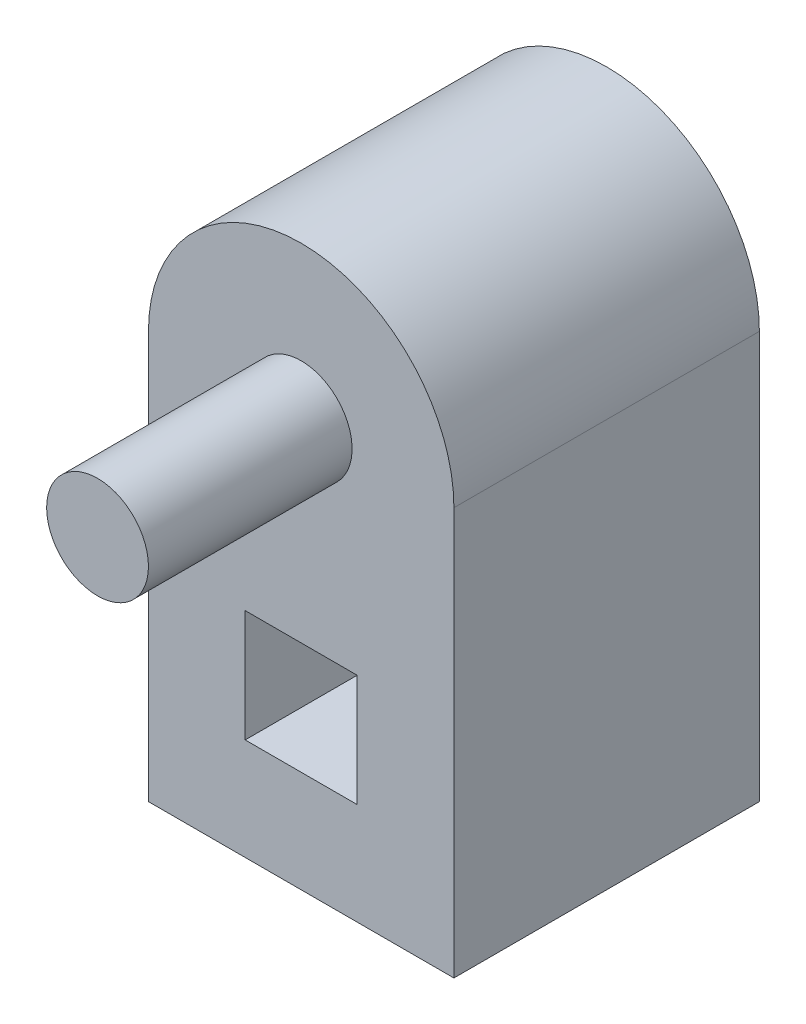
ISO-10303-21;
HEADER;
FILE_DESCRIPTION(('STEP AP214'),'2;1');
FILE_NAME('part.step','',(''),(''),'','','');
FILE_SCHEMA(('AUTOMOTIVE_DESIGN { 1 0 10303 214 1 1 1 1 }'));
ENDSEC;
DATA;
#1=APPLICATION_CONTEXT('core data for automotive mechanical design processes');
#2=APPLICATION_PROTOCOL_DEFINITION('international standard','automotive_design',2000,#1);
#3=PRODUCT_CONTEXT('',#1,'mechanical');
#4=PRODUCT('Part','Part','',(#3));
#5=PRODUCT_RELATED_PRODUCT_CATEGORY('part','',(#4));
#6=PRODUCT_DEFINITION_FORMATION('','',#4);
#7=PRODUCT_DEFINITION_CONTEXT('part definition',#1,'design');
#8=PRODUCT_DEFINITION('design','',#6,#7);
#9=PRODUCT_DEFINITION_SHAPE('','',#8);
#10=(LENGTH_UNIT() NAMED_UNIT(*) SI_UNIT(.MILLI.,.METRE.));
#11=(NAMED_UNIT(*) PLANE_ANGLE_UNIT() SI_UNIT($,.RADIAN.));
#12=(NAMED_UNIT(*) SI_UNIT($,.STERADIAN.) SOLID_ANGLE_UNIT());
#13=UNCERTAINTY_MEASURE_WITH_UNIT(LENGTH_MEASURE(1.E-05),#10,'distance_accuracy_value','');
#14=(GEOMETRIC_REPRESENTATION_CONTEXT(3) GLOBAL_UNCERTAINTY_ASSIGNED_CONTEXT((#13)) GLOBAL_UNIT_ASSIGNED_CONTEXT((#10,
#11,#12)) REPRESENTATION_CONTEXT('',''));
#15=CARTESIAN_POINT('',(0.,0.,0.));
#16=DIRECTION('',(0.,0.,1.));
#17=DIRECTION('',(1.,0.,0.));
#18=AXIS2_PLACEMENT_3D('',#15,#16,#17);
#19=CARTESIAN_POINT('',(38.1,101.6,-38.1));
#20=DIRECTION('',(-1.,0.,0.));
#21=DIRECTION('',(0.,0.,1.));
#22=AXIS2_PLACEMENT_3D('',#19,#20,#21);
#23=PLANE('',#22);
#24=DIRECTION('',(0.,0.,-1.));
#25=VECTOR('',#24,1.);
#26=CARTESIAN_POINT('',(38.1,0.,-38.1));
#27=LINE('',#26,#25);
#28=CARTESIAN_POINT('',(38.1,0.,38.1));
#29=VERTEX_POINT('',#28);
#30=CARTESIAN_POINT('',(38.1,0.,-38.1));
#31=VERTEX_POINT('',#30);
#32=EDGE_CURVE('E144',#29,#31,#27,.T.);
#33=ORIENTED_EDGE('',*,*,#32,.T.);
#34=DIRECTION('',(0.,-1.,0.));
#35=VECTOR('',#34,1.);
#36=CARTESIAN_POINT('',(38.1,101.6,-38.1));
#37=LINE('',#36,#35);
#38=CARTESIAN_POINT('',(38.1,101.6,-38.1));
#39=VERTEX_POINT('',#38);
#40=EDGE_CURVE('E46',#39,#31,#37,.T.);
#41=ORIENTED_EDGE('',*,*,#40,.F.);
#42=DIRECTION('',(0.,0.,-1.));
#43=VECTOR('',#42,1.);
#44=CARTESIAN_POINT('',(38.1,101.6,-38.1));
#45=LINE('',#44,#43);
#46=CARTESIAN_POINT('',(38.1,101.6,38.1));
#47=VERTEX_POINT('',#46);
#48=EDGE_CURVE('E148',#47,#39,#45,.T.);
#49=ORIENTED_EDGE('',*,*,#48,.F.);
#50=DIRECTION('',(0.,-1.,0.));
#51=VECTOR('',#50,1.);
#52=CARTESIAN_POINT('',(38.1,101.6,38.1));
#53=LINE('',#52,#51);
#54=EDGE_CURVE('E153',#47,#29,#53,.T.);
#55=ORIENTED_EDGE('',*,*,#54,.T.);
#56=EDGE_LOOP('',(#33,#41,#49,#55));
#57=FACE_BOUND('',#56,.T.);
#58=ADVANCED_FACE('F39',(#57),#23,.F.);
#59=CARTESIAN_POINT('',(-38.1,101.6,-38.1));
#60=DIRECTION('',(0.,0.,1.));
#61=DIRECTION('',(1.,0.,0.));
#62=AXIS2_PLACEMENT_3D('',#59,#60,#61);
#63=PLANE('',#62);
#64=DIRECTION('',(1.,0.,0.));
#65=VECTOR('',#64,1.);
#66=CARTESIAN_POINT('',(-13.97,25.4,-38.1));
#67=LINE('',#66,#65);
#68=CARTESIAN_POINT('',(-13.97,25.4,-38.1));
#69=VERTEX_POINT('',#68);
#70=CARTESIAN_POINT('',(13.97,25.4,-38.1));
#71=VERTEX_POINT('',#70);
#72=EDGE_CURVE('E135',#69,#71,#67,.T.);
#73=ORIENTED_EDGE('',*,*,#72,.T.);
#74=DIRECTION('',(0.,1.,0.));
#75=VECTOR('',#74,1.);
#76=CARTESIAN_POINT('',(13.97,53.34,-38.1));
#77=LINE('',#76,#75);
#78=CARTESIAN_POINT('',(13.97,53.34,-38.1));
#79=VERTEX_POINT('',#78);
#80=EDGE_CURVE('E125',#71,#79,#77,.T.);
#81=ORIENTED_EDGE('',*,*,#80,.T.);
#82=DIRECTION('',(-1.,0.,0.));
#83=VECTOR('',#82,1.);
#84=CARTESIAN_POINT('',(-13.97,53.34,-38.1));
#85=LINE('',#84,#83);
#86=CARTESIAN_POINT('',(-13.97,53.34,-38.1));
#87=VERTEX_POINT('',#86);
#88=EDGE_CURVE('E129',#79,#87,#85,.T.);
#89=ORIENTED_EDGE('',*,*,#88,.T.);
#90=DIRECTION('',(0.,-1.,0.));
#91=VECTOR('',#90,1.);
#92=CARTESIAN_POINT('',(-13.97,53.34,-38.1));
#93=LINE('',#92,#91);
#94=EDGE_CURVE('E52',#87,#69,#93,.T.);
#95=ORIENTED_EDGE('',*,*,#94,.T.);
#96=EDGE_LOOP('',(#73,#81,#89,#95));
#97=FACE_BOUND('',#96,.T.);
#98=DIRECTION('',(0.,-1.,0.));
#99=VECTOR('',#98,1.);
#100=CARTESIAN_POINT('',(-38.1,101.6,-38.1));
#101=LINE('',#100,#99);
#102=CARTESIAN_POINT('',(-38.1,101.6,-38.1));
#103=VERTEX_POINT('',#102);
#104=CARTESIAN_POINT('',(-38.1,0.,-38.1));
#105=VERTEX_POINT('',#104);
#106=EDGE_CURVE('E167',#103,#105,#101,.T.);
#107=ORIENTED_EDGE('',*,*,#106,.F.);
#108=CARTESIAN_POINT('',(0.,101.6,-38.1));
#109=DIRECTION('',(0.,0.,1.));
#110=DIRECTION('',(1.,0.,0.));
#111=AXIS2_PLACEMENT_3D('',#108,#109,#110);
#112=CIRCLE('',#111,38.1);
#113=EDGE_CURVE('E136',#39,#103,#112,.T.);
#114=ORIENTED_EDGE('',*,*,#113,.F.);
#115=ORIENTED_EDGE('',*,*,#40,.T.);
#116=DIRECTION('',(-1.,0.,0.));
#117=VECTOR('',#116,1.);
#118=CARTESIAN_POINT('',(-38.1,0.,-38.1));
#119=LINE('',#118,#117);
#120=EDGE_CURVE('E156',#31,#105,#119,.T.);
#121=ORIENTED_EDGE('',*,*,#120,.T.);
#122=EDGE_LOOP('',(#107,#114,#115,#121));
#123=FACE_BOUND('',#122,.T.);
#124=ADVANCED_FACE('F173',(#97,#123),#63,.F.);
#125=CARTESIAN_POINT('',(-38.1,101.6,-38.1));
#126=DIRECTION('',(1.,0.,0.));
#127=DIRECTION('',(0.,0.,-1.));
#128=AXIS2_PLACEMENT_3D('',#125,#126,#127);
#129=PLANE('',#128);
#130=DIRECTION('',(0.,0.,1.));
#131=VECTOR('',#130,1.);
#132=CARTESIAN_POINT('',(-38.1,0.,-38.1));
#133=LINE('',#132,#131);
#134=CARTESIAN_POINT('',(-38.1,0.,38.1));
#135=VERTEX_POINT('',#134);
#136=EDGE_CURVE('E158',#105,#135,#133,.T.);
#137=ORIENTED_EDGE('',*,*,#136,.T.);
#138=DIRECTION('',(0.,-1.,0.));
#139=VECTOR('',#138,1.);
#140=CARTESIAN_POINT('',(-38.1,101.6,38.1));
#141=LINE('',#140,#139);
#142=CARTESIAN_POINT('',(-38.1,101.6,38.1));
#143=VERTEX_POINT('',#142);
#144=EDGE_CURVE('E162',#143,#135,#141,.T.);
#145=ORIENTED_EDGE('',*,*,#144,.F.);
#146=DIRECTION('',(0.,0.,1.));
#147=VECTOR('',#146,1.);
#148=CARTESIAN_POINT('',(-38.1,101.6,-38.1));
#149=LINE('',#148,#147);
#150=EDGE_CURVE('E149',#103,#143,#149,.T.);
#151=ORIENTED_EDGE('',*,*,#150,.F.);
#152=ORIENTED_EDGE('',*,*,#106,.T.);
#153=EDGE_LOOP('',(#137,#145,#151,#152));
#154=FACE_BOUND('',#153,.T.);
#155=ADVANCED_FACE('F177',(#154),#129,.F.);
#156=CARTESIAN_POINT('',(-38.1,101.6,38.1));
#157=DIRECTION('',(0.,0.,-1.));
#158=DIRECTION('',(-1.,0.,0.));
#159=AXIS2_PLACEMENT_3D('',#156,#157,#158);
#160=PLANE('',#159);
#161=CARTESIAN_POINT('',(0.,101.6,38.1));
#162=DIRECTION('',(0.,0.,-1.));
#163=DIRECTION('',(-1.,0.,0.));
#164=AXIS2_PLACEMENT_3D('',#161,#162,#163);
#165=CIRCLE('',#164,12.7);
#166=CARTESIAN_POINT('',(-12.7,101.6,38.1));
#167=VERTEX_POINT('',#166);
#168=EDGE_CURVE('E11',#167,#167,#165,.F.);
#169=ORIENTED_EDGE('',*,*,#168,.F.);
#170=EDGE_LOOP('',(#169));
#171=FACE_BOUND('',#170,.T.);
#172=DIRECTION('',(-1.,0.,0.));
#173=VECTOR('',#172,1.);
#174=CARTESIAN_POINT('',(-13.97,53.34,38.1));
#175=LINE('',#174,#173);
#176=CARTESIAN_POINT('',(13.97,53.34,38.1));
#177=VERTEX_POINT('',#176);
#178=CARTESIAN_POINT('',(-13.97,53.34,38.1));
#179=VERTEX_POINT('',#178);
#180=EDGE_CURVE('E111',#177,#179,#175,.T.);
#181=ORIENTED_EDGE('',*,*,#180,.F.);
#182=DIRECTION('',(0.,1.,0.));
#183=VECTOR('',#182,1.);
#184=CARTESIAN_POINT('',(13.97,53.34,38.1));
#185=LINE('',#184,#183);
#186=CARTESIAN_POINT('',(13.97,25.4,38.1));
#187=VERTEX_POINT('',#186);
#188=EDGE_CURVE('E63',#187,#177,#185,.T.);
#189=ORIENTED_EDGE('',*,*,#188,.F.);
#190=DIRECTION('',(1.,0.,0.));
#191=VECTOR('',#190,1.);
#192=CARTESIAN_POINT('',(-13.97,25.4,38.1));
#193=LINE('',#192,#191);
#194=CARTESIAN_POINT('',(-13.97,25.4,38.1));
#195=VERTEX_POINT('',#194);
#196=EDGE_CURVE('E124',#195,#187,#193,.T.);
#197=ORIENTED_EDGE('',*,*,#196,.F.);
#198=DIRECTION('',(0.,-1.,0.));
#199=VECTOR('',#198,1.);
#200=CARTESIAN_POINT('',(-13.97,53.34,38.1));
#201=LINE('',#200,#199);
#202=EDGE_CURVE('E104',#179,#195,#201,.T.);
#203=ORIENTED_EDGE('',*,*,#202,.F.);
#204=EDGE_LOOP('',(#181,#189,#197,#203));
#205=FACE_BOUND('',#204,.T.);
#206=ORIENTED_EDGE('',*,*,#54,.F.);
#207=CARTESIAN_POINT('',(0.,101.6,38.1));
#208=DIRECTION('',(0.,0.,1.));
#209=DIRECTION('',(1.,0.,0.));
#210=AXIS2_PLACEMENT_3D('',#207,#208,#209);
#211=CIRCLE('',#210,38.1);
#212=EDGE_CURVE('E142',#47,#143,#211,.T.);
#213=ORIENTED_EDGE('',*,*,#212,.T.);
#214=ORIENTED_EDGE('',*,*,#144,.T.);
#215=DIRECTION('',(1.,0.,0.));
#216=VECTOR('',#215,1.);
#217=CARTESIAN_POINT('',(-38.1,0.,38.1));
#218=LINE('',#217,#216);
#219=EDGE_CURVE('E147',#135,#29,#218,.T.);
#220=ORIENTED_EDGE('',*,*,#219,.T.);
#221=EDGE_LOOP('',(#206,#213,#214,#220));
#222=FACE_BOUND('',#221,.T.);
#223=ADVANCED_FACE('F116',(#171,#205,#222),#160,.F.);
#224=CARTESIAN_POINT('',(0.,0.,0.));
#225=DIRECTION('',(0.,1.,0.));
#226=DIRECTION('',(0.,0.,1.));
#227=AXIS2_PLACEMENT_3D('',#224,#225,#226);
#228=PLANE('',#227);
#229=ORIENTED_EDGE('',*,*,#32,.F.);
#230=ORIENTED_EDGE('',*,*,#219,.F.);
#231=ORIENTED_EDGE('',*,*,#136,.F.);
#232=ORIENTED_EDGE('',*,*,#120,.F.);
#233=EDGE_LOOP('',(#229,#230,#231,#232));
#234=FACE_BOUND('',#233,.T.);
#235=ADVANCED_FACE('F176',(#234),#228,.F.);
#236=CARTESIAN_POINT('',(0.,101.6,38.1));
#237=DIRECTION('',(0.,0.,-1.));
#238=DIRECTION('',(-1.,0.,0.));
#239=AXIS2_PLACEMENT_3D('',#236,#237,#238);
#240=CYLINDRICAL_SURFACE('',#239,38.1);
#241=ORIENTED_EDGE('',*,*,#48,.T.);
#242=ORIENTED_EDGE('',*,*,#113,.T.);
#243=ORIENTED_EDGE('',*,*,#150,.T.);
#244=ORIENTED_EDGE('',*,*,#212,.F.);
#245=EDGE_LOOP('',(#241,#242,#243,#244));
#246=FACE_BOUND('',#245,.T.);
#247=ADVANCED_FACE('F184',(#246),#240,.T.);
#248=CARTESIAN_POINT('',(13.97,53.34,-38.1));
#249=DIRECTION('',(1.,0.,0.));
#250=DIRECTION('',(0.,1.,0.));
#251=AXIS2_PLACEMENT_3D('',#248,#249,#250);
#252=PLANE('',#251);
#253=DIRECTION('',(0.,0.,1.));
#254=VECTOR('',#253,1.);
#255=CARTESIAN_POINT('',(13.97,53.34,-38.1));
#256=LINE('',#255,#254);
#257=EDGE_CURVE('E112',#79,#177,#256,.T.);
#258=ORIENTED_EDGE('',*,*,#257,.F.);
#259=ORIENTED_EDGE('',*,*,#80,.F.);
#260=DIRECTION('',(0.,0.,1.));
#261=VECTOR('',#260,1.);
#262=CARTESIAN_POINT('',(13.97,25.4,-38.1));
#263=LINE('',#262,#261);
#264=EDGE_CURVE('E132',#71,#187,#263,.T.);
#265=ORIENTED_EDGE('',*,*,#264,.T.);
#266=ORIENTED_EDGE('',*,*,#188,.T.);
#267=EDGE_LOOP('',(#258,#259,#265,#266));
#268=FACE_BOUND('',#267,.T.);
#269=ADVANCED_FACE('F188',(#268),#252,.F.);
#270=CARTESIAN_POINT('',(-13.97,25.4,-38.1));
#271=DIRECTION('',(0.,-1.,0.));
#272=DIRECTION('',(1.,0.,0.));
#273=AXIS2_PLACEMENT_3D('',#270,#271,#272);
#274=PLANE('',#273);
#275=ORIENTED_EDGE('',*,*,#264,.F.);
#276=ORIENTED_EDGE('',*,*,#72,.F.);
#277=DIRECTION('',(0.,0.,1.));
#278=VECTOR('',#277,1.);
#279=CARTESIAN_POINT('',(-13.97,25.4,-38.1));
#280=LINE('',#279,#278);
#281=EDGE_CURVE('E109',#69,#195,#280,.T.);
#282=ORIENTED_EDGE('',*,*,#281,.T.);
#283=ORIENTED_EDGE('',*,*,#196,.T.);
#284=EDGE_LOOP('',(#275,#276,#282,#283));
#285=FACE_BOUND('',#284,.T.);
#286=ADVANCED_FACE('F195',(#285),#274,.F.);
#287=CARTESIAN_POINT('',(-13.97,53.34,-38.1));
#288=DIRECTION('',(-1.,0.,0.));
#289=DIRECTION('',(0.,-1.,0.));
#290=AXIS2_PLACEMENT_3D('',#287,#288,#289);
#291=PLANE('',#290);
#292=ORIENTED_EDGE('',*,*,#281,.F.);
#293=ORIENTED_EDGE('',*,*,#94,.F.);
#294=DIRECTION('',(0.,0.,1.));
#295=VECTOR('',#294,1.);
#296=CARTESIAN_POINT('',(-13.97,53.34,-38.1));
#297=LINE('',#296,#295);
#298=EDGE_CURVE('E101',#87,#179,#297,.T.);
#299=ORIENTED_EDGE('',*,*,#298,.T.);
#300=ORIENTED_EDGE('',*,*,#202,.T.);
#301=EDGE_LOOP('',(#292,#293,#299,#300));
#302=FACE_BOUND('',#301,.T.);
#303=ADVANCED_FACE('F103',(#302),#291,.F.);
#304=CARTESIAN_POINT('',(-13.97,53.34,-38.1));
#305=DIRECTION('',(0.,1.,0.));
#306=DIRECTION('',(0.,0.,1.));
#307=AXIS2_PLACEMENT_3D('',#304,#305,#306);
#308=PLANE('',#307);
#309=ORIENTED_EDGE('',*,*,#298,.F.);
#310=ORIENTED_EDGE('',*,*,#88,.F.);
#311=ORIENTED_EDGE('',*,*,#257,.T.);
#312=ORIENTED_EDGE('',*,*,#180,.T.);
#313=EDGE_LOOP('',(#309,#310,#311,#312));
#314=FACE_BOUND('',#313,.T.);
#315=ADVANCED_FACE('F113',(#314),#308,.F.);
#316=CARTESIAN_POINT('',(0.,101.6,88.9));
#317=DIRECTION('',(0.,0.,-1.));
#318=DIRECTION('',(-1.,0.,0.));
#319=AXIS2_PLACEMENT_3D('',#316,#317,#318);
#320=CYLINDRICAL_SURFACE('',#319,12.7);
#321=CARTESIAN_POINT('',(0.,101.6,88.9));
#322=DIRECTION('',(0.,0.,1.));
#323=DIRECTION('',(1.,0.,0.));
#324=AXIS2_PLACEMENT_3D('',#321,#322,#323);
#325=CIRCLE('',#324,12.7);
#326=CARTESIAN_POINT('',(12.7,101.6,88.9));
#327=VERTEX_POINT('',#326);
#328=EDGE_CURVE('E299',#327,#327,#325,.T.);
#329=ORIENTED_EDGE('',*,*,#328,.F.);
#330=EDGE_LOOP('',(#329));
#331=FACE_BOUND('',#330,.T.);
#332=ORIENTED_EDGE('',*,*,#168,.T.);
#333=EDGE_LOOP('',(#332));
#334=FACE_BOUND('',#333,.T.);
#335=ADVANCED_FACE('F213',(#331,#334),#320,.T.);
#336=CARTESIAN_POINT('',(0.,101.6,88.9));
#337=DIRECTION('',(0.,0.,1.));
#338=DIRECTION('',(1.,0.,0.));
#339=AXIS2_PLACEMENT_3D('',#336,#337,#338);
#340=PLANE('',#339);
#341=ORIENTED_EDGE('',*,*,#328,.T.);
#342=EDGE_LOOP('',(#341));
#343=FACE_BOUND('',#342,.T.);
#344=ADVANCED_FACE('F212',(#343),#340,.T.);
#345=CLOSED_SHELL('',(#58,#124,#155,#223,#235,#247,#269,#286,#303,#315,#335,#344));
#346=MANIFOLD_SOLID_BREP('B2',#345);
#347=ADVANCED_BREP_SHAPE_REPRESENTATION('',(#18,#346),#14);
#348=SHAPE_DEFINITION_REPRESENTATION(#9,#347);
ENDSEC;
END-ISO-10303-21;
